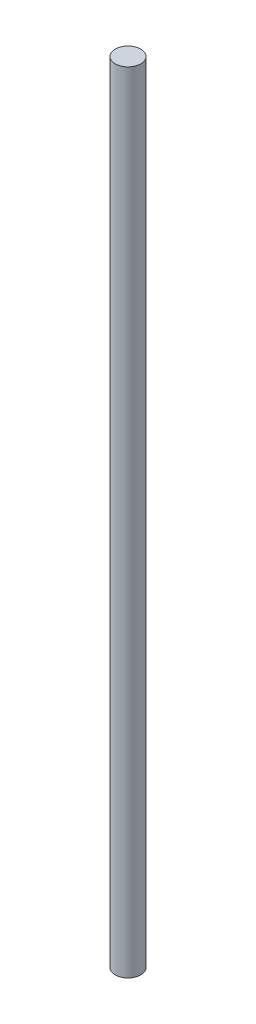
ISO-10303-21;
HEADER;
FILE_DESCRIPTION(('STEP AP214'),'2;1');
FILE_NAME('part.step','',(''),(''),'','','');
FILE_SCHEMA(('AUTOMOTIVE_DESIGN { 1 0 10303 214 1 1 1 1 }'));
ENDSEC;
DATA;
#1=APPLICATION_CONTEXT('core data for automotive mechanical design processes');
#2=APPLICATION_PROTOCOL_DEFINITION('international standard','automotive_design',2000,#1);
#3=PRODUCT_CONTEXT('',#1,'mechanical');
#4=PRODUCT('Part','Part','',(#3));
#5=PRODUCT_RELATED_PRODUCT_CATEGORY('part','',(#4));
#6=PRODUCT_DEFINITION_FORMATION('','',#4);
#7=PRODUCT_DEFINITION_CONTEXT('part definition',#1,'design');
#8=PRODUCT_DEFINITION('design','',#6,#7);
#9=PRODUCT_DEFINITION_SHAPE('','',#8);
#10=(LENGTH_UNIT() NAMED_UNIT(*) SI_UNIT(.MILLI.,.METRE.));
#11=(NAMED_UNIT(*) PLANE_ANGLE_UNIT() SI_UNIT($,.RADIAN.));
#12=(NAMED_UNIT(*) SI_UNIT($,.STERADIAN.) SOLID_ANGLE_UNIT());
#13=UNCERTAINTY_MEASURE_WITH_UNIT(LENGTH_MEASURE(1.E-05),#10,'distance_accuracy_value','');
#14=(GEOMETRIC_REPRESENTATION_CONTEXT(3) GLOBAL_UNCERTAINTY_ASSIGNED_CONTEXT((#13)) GLOBAL_UNIT_ASSIGNED_CONTEXT((#10,
#11,#12)) REPRESENTATION_CONTEXT('',''));
#15=CARTESIAN_POINT('',(0.,0.,0.));
#16=DIRECTION('',(0.,0.,1.));
#17=DIRECTION('',(1.,0.,0.));
#18=AXIS2_PLACEMENT_3D('',#15,#16,#17);
#19=CARTESIAN_POINT('',(0.,305.562,0.));
#20=DIRECTION('',(0.,-1.,0.));
#21=DIRECTION('',(0.,0.,-1.));
#22=AXIS2_PLACEMENT_3D('',#19,#20,#21);
#23=CYLINDRICAL_SURFACE('',#22,4.953);
#24=CARTESIAN_POINT('',(0.,305.562,0.));
#25=DIRECTION('',(0.,1.,0.));
#26=DIRECTION('',(0.,0.,1.));
#27=AXIS2_PLACEMENT_3D('',#24,#25,#26);
#28=CIRCLE('',#27,4.953);
#29=CARTESIAN_POINT('',(0.,305.562,4.953));
#30=VERTEX_POINT('',#29);
#31=EDGE_CURVE('E10',#30,#30,#28,.T.);
#32=ORIENTED_EDGE('',*,*,#31,.F.);
#33=EDGE_LOOP('',(#32));
#34=FACE_BOUND('',#33,.T.);
#35=CARTESIAN_POINT('',(0.,0.,0.));
#36=DIRECTION('',(0.,1.,0.));
#37=DIRECTION('',(0.,0.,1.));
#38=AXIS2_PLACEMENT_3D('',#35,#36,#37);
#39=CIRCLE('',#38,4.953);
#40=CARTESIAN_POINT('',(0.,0.,4.953));
#41=VERTEX_POINT('',#40);
#42=EDGE_CURVE('E40',#41,#41,#39,.T.);
#43=ORIENTED_EDGE('',*,*,#42,.T.);
#44=EDGE_LOOP('',(#43));
#45=FACE_BOUND('',#44,.T.);
#46=ADVANCED_FACE('F37',(#34,#45),#23,.T.);
#47=CARTESIAN_POINT('',(0.,305.562,0.));
#48=DIRECTION('',(0.,1.,0.));
#49=DIRECTION('',(0.,0.,1.));
#50=AXIS2_PLACEMENT_3D('',#47,#48,#49);
#51=PLANE('',#50);
#52=ORIENTED_EDGE('',*,*,#31,.T.);
#53=EDGE_LOOP('',(#52));
#54=FACE_BOUND('',#53,.T.);
#55=ADVANCED_FACE('F54',(#54),#51,.T.);
#56=CARTESIAN_POINT('',(0.,0.,0.));
#57=DIRECTION('',(0.,1.,0.));
#58=DIRECTION('',(0.,0.,1.));
#59=AXIS2_PLACEMENT_3D('',#56,#57,#58);
#60=PLANE('',#59);
#61=ORIENTED_EDGE('',*,*,#42,.F.);
#62=EDGE_LOOP('',(#61));
#63=FACE_BOUND('',#62,.T.);
#64=ADVANCED_FACE('F52',(#63),#60,.F.);
#65=CLOSED_SHELL('',(#46,#55,#64));
#66=MANIFOLD_SOLID_BREP('B2',#65);
#67=ADVANCED_BREP_SHAPE_REPRESENTATION('',(#18,#66),#14);
#68=SHAPE_DEFINITION_REPRESENTATION(#9,#67);
ENDSEC;
END-ISO-10303-21;
